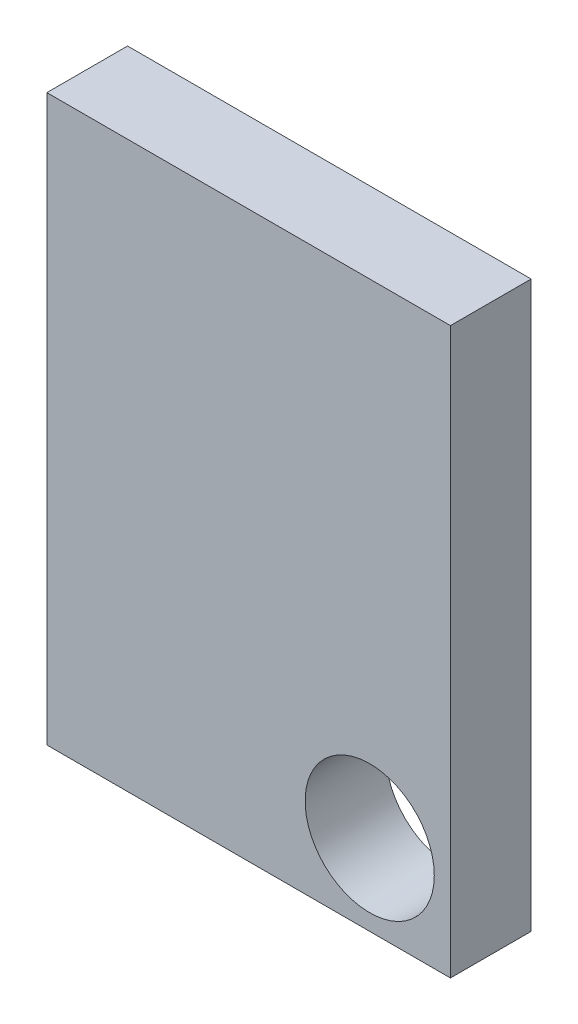
ISO-10303-21;
HEADER;
FILE_DESCRIPTION(('STEP AP214'),'2;1');
FILE_NAME('part.step','',(''),(''),'','','');
FILE_SCHEMA(('AUTOMOTIVE_DESIGN { 1 0 10303 214 1 1 1 1 }'));
ENDSEC;
DATA;
#1=APPLICATION_CONTEXT('core data for automotive mechanical design processes');
#2=APPLICATION_PROTOCOL_DEFINITION('international standard','automotive_design',2000,#1);
#3=PRODUCT_CONTEXT('',#1,'mechanical');
#4=PRODUCT('Part','Part','',(#3));
#5=PRODUCT_RELATED_PRODUCT_CATEGORY('part','',(#4));
#6=PRODUCT_DEFINITION_FORMATION('','',#4);
#7=PRODUCT_DEFINITION_CONTEXT('part definition',#1,'design');
#8=PRODUCT_DEFINITION('design','',#6,#7);
#9=PRODUCT_DEFINITION_SHAPE('','',#8);
#10=(LENGTH_UNIT() NAMED_UNIT(*) SI_UNIT(.MILLI.,.METRE.));
#11=(NAMED_UNIT(*) PLANE_ANGLE_UNIT() SI_UNIT($,.RADIAN.));
#12=(NAMED_UNIT(*) SI_UNIT($,.STERADIAN.) SOLID_ANGLE_UNIT());
#13=UNCERTAINTY_MEASURE_WITH_UNIT(LENGTH_MEASURE(1.E-05),#10,'distance_accuracy_value','');
#14=(GEOMETRIC_REPRESENTATION_CONTEXT(3) GLOBAL_UNCERTAINTY_ASSIGNED_CONTEXT((#13)) GLOBAL_UNIT_ASSIGNED_CONTEXT((#10,
#11,#12)) REPRESENTATION_CONTEXT('',''));
#15=CARTESIAN_POINT('',(0.,0.,0.));
#16=DIRECTION('',(0.,0.,1.));
#17=DIRECTION('',(1.,0.,0.));
#18=AXIS2_PLACEMENT_3D('',#15,#16,#17);
#19=CARTESIAN_POINT('',(12.5,-17.5,5.));
#20=DIRECTION('',(-1.,0.,0.));
#21=DIRECTION('',(0.,0.,1.));
#22=AXIS2_PLACEMENT_3D('',#19,#20,#21);
#23=PLANE('',#22);
#24=DIRECTION('',(0.,1.,0.));
#25=VECTOR('',#24,1.);
#26=CARTESIAN_POINT('',(12.5,-17.5,0.));
#27=LINE('',#26,#25);
#28=CARTESIAN_POINT('',(12.5,-17.5,0.));
#29=VERTEX_POINT('',#28);
#30=CARTESIAN_POINT('',(12.5,17.5,0.));
#31=VERTEX_POINT('',#30);
#32=EDGE_CURVE('E100',#29,#31,#27,.T.);
#33=ORIENTED_EDGE('',*,*,#32,.T.);
#34=DIRECTION('',(0.,0.,-1.));
#35=VECTOR('',#34,1.);
#36=CARTESIAN_POINT('',(12.5,17.5,5.));
#37=LINE('',#36,#35);
#38=CARTESIAN_POINT('',(12.5,17.5,5.));
#39=VERTEX_POINT('',#38);
#40=EDGE_CURVE('E11',#39,#31,#37,.T.);
#41=ORIENTED_EDGE('',*,*,#40,.F.);
#42=DIRECTION('',(0.,1.,0.));
#43=VECTOR('',#42,1.);
#44=CARTESIAN_POINT('',(12.5,-17.5,5.));
#45=LINE('',#44,#43);
#46=CARTESIAN_POINT('',(12.5,-17.5,5.));
#47=VERTEX_POINT('',#46);
#48=EDGE_CURVE('E88',#47,#39,#45,.T.);
#49=ORIENTED_EDGE('',*,*,#48,.F.);
#50=DIRECTION('',(0.,0.,-1.));
#51=VECTOR('',#50,1.);
#52=CARTESIAN_POINT('',(12.5,-17.5,5.));
#53=LINE('',#52,#51);
#54=EDGE_CURVE('E96',#47,#29,#53,.T.);
#55=ORIENTED_EDGE('',*,*,#54,.T.);
#56=EDGE_LOOP('',(#33,#41,#49,#55));
#57=FACE_BOUND('',#56,.T.);
#58=ADVANCED_FACE('F37',(#57),#23,.F.);
#59=CARTESIAN_POINT('',(-12.5,17.5,5.));
#60=DIRECTION('',(0.,-1.,0.));
#61=DIRECTION('',(0.,0.,-1.));
#62=AXIS2_PLACEMENT_3D('',#59,#60,#61);
#63=PLANE('',#62);
#64=DIRECTION('',(-1.,0.,0.));
#65=VECTOR('',#64,1.);
#66=CARTESIAN_POINT('',(-12.5,17.5,0.));
#67=LINE('',#66,#65);
#68=CARTESIAN_POINT('',(-12.5,17.5,0.));
#69=VERTEX_POINT('',#68);
#70=EDGE_CURVE('E92',#31,#69,#67,.T.);
#71=ORIENTED_EDGE('',*,*,#70,.T.);
#72=DIRECTION('',(0.,0.,-1.));
#73=VECTOR('',#72,1.);
#74=CARTESIAN_POINT('',(-12.5,17.5,5.));
#75=LINE('',#74,#73);
#76=CARTESIAN_POINT('',(-12.5,17.5,5.));
#77=VERTEX_POINT('',#76);
#78=EDGE_CURVE('E45',#77,#69,#75,.T.);
#79=ORIENTED_EDGE('',*,*,#78,.F.);
#80=DIRECTION('',(-1.,0.,0.));
#81=VECTOR('',#80,1.);
#82=CARTESIAN_POINT('',(-12.5,17.5,5.));
#83=LINE('',#82,#81);
#84=EDGE_CURVE('E83',#39,#77,#83,.T.);
#85=ORIENTED_EDGE('',*,*,#84,.F.);
#86=ORIENTED_EDGE('',*,*,#40,.T.);
#87=EDGE_LOOP('',(#71,#79,#85,#86));
#88=FACE_BOUND('',#87,.T.);
#89=ADVANCED_FACE('F91',(#88),#63,.F.);
#90=CARTESIAN_POINT('',(-12.5,-17.5,5.));
#91=DIRECTION('',(1.,0.,0.));
#92=DIRECTION('',(0.,0.,-1.));
#93=AXIS2_PLACEMENT_3D('',#90,#91,#92);
#94=PLANE('',#93);
#95=DIRECTION('',(0.,-1.,0.));
#96=VECTOR('',#95,1.);
#97=CARTESIAN_POINT('',(-12.5,-17.5,0.));
#98=LINE('',#97,#96);
#99=CARTESIAN_POINT('',(-12.5,-17.5,0.));
#100=VERTEX_POINT('',#99);
#101=EDGE_CURVE('E70',#69,#100,#98,.T.);
#102=ORIENTED_EDGE('',*,*,#101,.T.);
#103=DIRECTION('',(0.,0.,-1.));
#104=VECTOR('',#103,1.);
#105=CARTESIAN_POINT('',(-12.5,-17.5,5.));
#106=LINE('',#105,#104);
#107=CARTESIAN_POINT('',(-12.5,-17.5,5.));
#108=VERTEX_POINT('',#107);
#109=EDGE_CURVE('E93',#108,#100,#106,.T.);
#110=ORIENTED_EDGE('',*,*,#109,.F.);
#111=DIRECTION('',(0.,-1.,0.));
#112=VECTOR('',#111,1.);
#113=CARTESIAN_POINT('',(-12.5,-17.5,5.));
#114=LINE('',#113,#112);
#115=EDGE_CURVE('E86',#77,#108,#114,.T.);
#116=ORIENTED_EDGE('',*,*,#115,.F.);
#117=ORIENTED_EDGE('',*,*,#78,.T.);
#118=EDGE_LOOP('',(#102,#110,#116,#117));
#119=FACE_BOUND('',#118,.T.);
#120=ADVANCED_FACE('F94',(#119),#94,.F.);
#121=CARTESIAN_POINT('',(-12.5,-17.5,5.));
#122=DIRECTION('',(0.,1.,0.));
#123=DIRECTION('',(0.,0.,1.));
#124=AXIS2_PLACEMENT_3D('',#121,#122,#123);
#125=PLANE('',#124);
#126=DIRECTION('',(1.,0.,0.));
#127=VECTOR('',#126,1.);
#128=CARTESIAN_POINT('',(-12.5,-17.5,0.));
#129=LINE('',#128,#127);
#130=EDGE_CURVE('E76',#100,#29,#129,.T.);
#131=ORIENTED_EDGE('',*,*,#130,.T.);
#132=ORIENTED_EDGE('',*,*,#54,.F.);
#133=DIRECTION('',(1.,0.,0.));
#134=VECTOR('',#133,1.);
#135=CARTESIAN_POINT('',(-12.5,-17.5,5.));
#136=LINE('',#135,#134);
#137=EDGE_CURVE('E53',#108,#47,#136,.T.);
#138=ORIENTED_EDGE('',*,*,#137,.F.);
#139=ORIENTED_EDGE('',*,*,#109,.T.);
#140=EDGE_LOOP('',(#131,#132,#138,#139));
#141=FACE_BOUND('',#140,.T.);
#142=ADVANCED_FACE('F108',(#141),#125,.F.);
#143=CARTESIAN_POINT('',(0.,0.,5.));
#144=DIRECTION('',(0.,0.,-1.));
#145=DIRECTION('',(-1.,0.,0.));
#146=AXIS2_PLACEMENT_3D('',#143,#144,#145);
#147=PLANE('',#146);
#148=CARTESIAN_POINT('',(7.5,-12.5,5.));
#149=DIRECTION('',(0.,0.,1.));
#150=DIRECTION('',(1.,0.,0.));
#151=AXIS2_PLACEMENT_3D('',#148,#149,#150);
#152=CIRCLE('',#151,4.);
#153=CARTESIAN_POINT('',(11.5,-12.5,5.));
#154=VERTEX_POINT('',#153);
#155=EDGE_CURVE('E114',#154,#154,#152,.T.);
#156=ORIENTED_EDGE('',*,*,#155,.F.);
#157=EDGE_LOOP('',(#156));
#158=FACE_BOUND('',#157,.T.);
#159=ORIENTED_EDGE('',*,*,#48,.T.);
#160=ORIENTED_EDGE('',*,*,#84,.T.);
#161=ORIENTED_EDGE('',*,*,#115,.T.);
#162=ORIENTED_EDGE('',*,*,#137,.T.);
#163=EDGE_LOOP('',(#159,#160,#161,#162));
#164=FACE_BOUND('',#163,.T.);
#165=ADVANCED_FACE('F84',(#158,#164),#147,.F.);
#166=CARTESIAN_POINT('',(0.,0.,0.));
#167=DIRECTION('',(0.,0.,-1.));
#168=DIRECTION('',(-1.,0.,0.));
#169=AXIS2_PLACEMENT_3D('',#166,#167,#168);
#170=PLANE('',#169);
#171=CARTESIAN_POINT('',(7.5,-12.5,0.));
#172=DIRECTION('',(0.,0.,1.));
#173=DIRECTION('',(1.,0.,0.));
#174=AXIS2_PLACEMENT_3D('',#171,#172,#173);
#175=CIRCLE('',#174,4.);
#176=CARTESIAN_POINT('',(11.5,-12.5,0.));
#177=VERTEX_POINT('',#176);
#178=EDGE_CURVE('E103',#177,#177,#175,.T.);
#179=ORIENTED_EDGE('',*,*,#178,.T.);
#180=EDGE_LOOP('',(#179));
#181=FACE_BOUND('',#180,.T.);
#182=ORIENTED_EDGE('',*,*,#32,.F.);
#183=ORIENTED_EDGE('',*,*,#130,.F.);
#184=ORIENTED_EDGE('',*,*,#101,.F.);
#185=ORIENTED_EDGE('',*,*,#70,.F.);
#186=EDGE_LOOP('',(#182,#183,#184,#185));
#187=FACE_BOUND('',#186,.T.);
#188=ADVANCED_FACE('F111',(#181,#187),#170,.T.);
#189=CARTESIAN_POINT('',(7.5,-12.5,0.));
#190=DIRECTION('',(0.,0.,1.));
#191=DIRECTION('',(1.,0.,0.));
#192=AXIS2_PLACEMENT_3D('',#189,#190,#191);
#193=CYLINDRICAL_SURFACE('',#192,4.);
#194=ORIENTED_EDGE('',*,*,#178,.F.);
#195=EDGE_LOOP('',(#194));
#196=FACE_BOUND('',#195,.T.);
#197=ORIENTED_EDGE('',*,*,#155,.T.);
#198=EDGE_LOOP('',(#197));
#199=FACE_BOUND('',#198,.T.);
#200=ADVANCED_FACE('F121',(#196,#199),#193,.F.);
#201=CLOSED_SHELL('',(#58,#89,#120,#142,#165,#188,#200));
#202=MANIFOLD_SOLID_BREP('B2',#201);
#203=ADVANCED_BREP_SHAPE_REPRESENTATION('',(#18,#202),#14);
#204=SHAPE_DEFINITION_REPRESENTATION(#9,#203);
ENDSEC;
END-ISO-10303-21;
